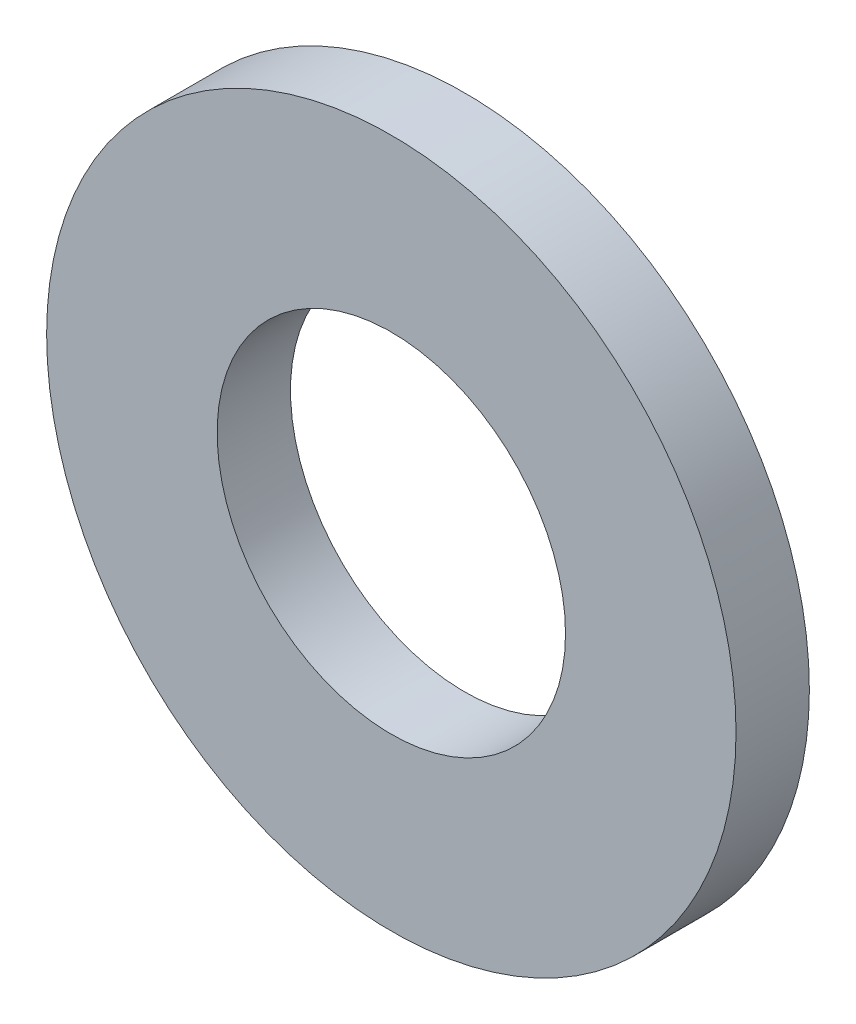
ISO-10303-21;
HEADER;
FILE_DESCRIPTION(('STEP AP214'),'2;1');
FILE_NAME('part.step','',(''),(''),'','','');
FILE_SCHEMA(('AUTOMOTIVE_DESIGN { 1 0 10303 214 1 1 1 1 }'));
ENDSEC;
DATA;
#1=APPLICATION_CONTEXT('core data for automotive mechanical design processes');
#2=APPLICATION_PROTOCOL_DEFINITION('international standard','automotive_design',2000,#1);
#3=PRODUCT_CONTEXT('',#1,'mechanical');
#4=PRODUCT('Part','Part','',(#3));
#5=PRODUCT_RELATED_PRODUCT_CATEGORY('part','',(#4));
#6=PRODUCT_DEFINITION_FORMATION('','',#4);
#7=PRODUCT_DEFINITION_CONTEXT('part definition',#1,'design');
#8=PRODUCT_DEFINITION('design','',#6,#7);
#9=PRODUCT_DEFINITION_SHAPE('','',#8);
#10=(LENGTH_UNIT() NAMED_UNIT(*) SI_UNIT(.MILLI.,.METRE.));
#11=(NAMED_UNIT(*) PLANE_ANGLE_UNIT() SI_UNIT($,.RADIAN.));
#12=(NAMED_UNIT(*) SI_UNIT($,.STERADIAN.) SOLID_ANGLE_UNIT());
#13=UNCERTAINTY_MEASURE_WITH_UNIT(LENGTH_MEASURE(1.E-05),#10,'distance_accuracy_value','');
#14=(GEOMETRIC_REPRESENTATION_CONTEXT(3) GLOBAL_UNCERTAINTY_ASSIGNED_CONTEXT((#13)) GLOBAL_UNIT_ASSIGNED_CONTEXT((#10,
#11,#12)) REPRESENTATION_CONTEXT('',''));
#15=CARTESIAN_POINT('',(0.,0.,0.));
#16=DIRECTION('',(0.,0.,1.));
#17=DIRECTION('',(1.,0.,0.));
#18=AXIS2_PLACEMENT_3D('',#15,#16,#17);
#19=CARTESIAN_POINT('',(0.,0.,-2.));
#20=DIRECTION('',(0.,0.,1.));
#21=DIRECTION('',(1.,0.,0.));
#22=AXIS2_PLACEMENT_3D('',#19,#20,#21);
#23=CYLINDRICAL_SURFACE('',#22,9.4);
#24=CARTESIAN_POINT('',(0.,0.,-2.));
#25=DIRECTION('',(0.,0.,1.));
#26=DIRECTION('',(1.,0.,0.));
#27=AXIS2_PLACEMENT_3D('',#24,#25,#26);
#28=CIRCLE('',#27,9.4);
#29=CARTESIAN_POINT('',(9.4,0.,-2.));
#30=VERTEX_POINT('',#29);
#31=EDGE_CURVE('E10',#30,#30,#28,.T.);
#32=ORIENTED_EDGE('',*,*,#31,.T.);
#33=EDGE_LOOP('',(#32));
#34=FACE_BOUND('',#33,.T.);
#35=CARTESIAN_POINT('',(0.,0.,0.));
#36=DIRECTION('',(0.,0.,1.));
#37=DIRECTION('',(1.,0.,0.));
#38=AXIS2_PLACEMENT_3D('',#35,#36,#37);
#39=CIRCLE('',#38,9.4);
#40=CARTESIAN_POINT('',(9.4,0.,0.));
#41=VERTEX_POINT('',#40);
#42=EDGE_CURVE('E33',#41,#41,#39,.T.);
#43=ORIENTED_EDGE('',*,*,#42,.F.);
#44=EDGE_LOOP('',(#43));
#45=FACE_BOUND('',#44,.T.);
#46=ADVANCED_FACE('F30',(#34,#45),#23,.T.);
#47=CARTESIAN_POINT('',(0.,0.,-2.));
#48=DIRECTION('',(0.,0.,1.));
#49=DIRECTION('',(1.,0.,0.));
#50=AXIS2_PLACEMENT_3D('',#47,#48,#49);
#51=PLANE('',#50);
#52=CARTESIAN_POINT('',(0.,0.,-2.));
#53=DIRECTION('',(0.,0.,1.));
#54=DIRECTION('',(1.,0.,0.));
#55=AXIS2_PLACEMENT_3D('',#52,#53,#54);
#56=CIRCLE('',#55,4.75);
#57=CARTESIAN_POINT('',(4.75,0.,-2.));
#58=VERTEX_POINT('',#57);
#59=EDGE_CURVE('E40',#58,#58,#56,.T.);
#60=ORIENTED_EDGE('',*,*,#59,.T.);
#61=EDGE_LOOP('',(#60));
#62=FACE_BOUND('',#61,.T.);
#63=ORIENTED_EDGE('',*,*,#31,.F.);
#64=EDGE_LOOP('',(#63));
#65=FACE_BOUND('',#64,.T.);
#66=ADVANCED_FACE('F48',(#62,#65),#51,.F.);
#67=CARTESIAN_POINT('',(0.,0.,0.));
#68=DIRECTION('',(0.,0.,1.));
#69=DIRECTION('',(1.,0.,0.));
#70=AXIS2_PLACEMENT_3D('',#67,#68,#69);
#71=PLANE('',#70);
#72=CARTESIAN_POINT('',(0.,0.,0.));
#73=DIRECTION('',(0.,0.,1.));
#74=DIRECTION('',(1.,0.,0.));
#75=AXIS2_PLACEMENT_3D('',#72,#73,#74);
#76=CIRCLE('',#75,4.75);
#77=CARTESIAN_POINT('',(4.75,0.,0.));
#78=VERTEX_POINT('',#77);
#79=EDGE_CURVE('E42',#78,#78,#76,.T.);
#80=ORIENTED_EDGE('',*,*,#79,.F.);
#81=EDGE_LOOP('',(#80));
#82=FACE_BOUND('',#81,.T.);
#83=ORIENTED_EDGE('',*,*,#42,.T.);
#84=EDGE_LOOP('',(#83));
#85=FACE_BOUND('',#84,.T.);
#86=ADVANCED_FACE('F54',(#82,#85),#71,.T.);
#87=CARTESIAN_POINT('',(0.,0.,-2.));
#88=DIRECTION('',(0.,0.,1.));
#89=DIRECTION('',(1.,0.,0.));
#90=AXIS2_PLACEMENT_3D('',#87,#88,#89);
#91=CYLINDRICAL_SURFACE('',#90,4.75);
#92=ORIENTED_EDGE('',*,*,#59,.F.);
#93=EDGE_LOOP('',(#92));
#94=FACE_BOUND('',#93,.T.);
#95=ORIENTED_EDGE('',*,*,#79,.T.);
#96=EDGE_LOOP('',(#95));
#97=FACE_BOUND('',#96,.T.);
#98=ADVANCED_FACE('F51',(#94,#97),#91,.F.);
#99=CLOSED_SHELL('',(#46,#66,#86,#98));
#100=MANIFOLD_SOLID_BREP('B2',#99);
#101=ADVANCED_BREP_SHAPE_REPRESENTATION('',(#18,#100),#14);
#102=SHAPE_DEFINITION_REPRESENTATION(#9,#101);
ENDSEC;
END-ISO-10303-21;
